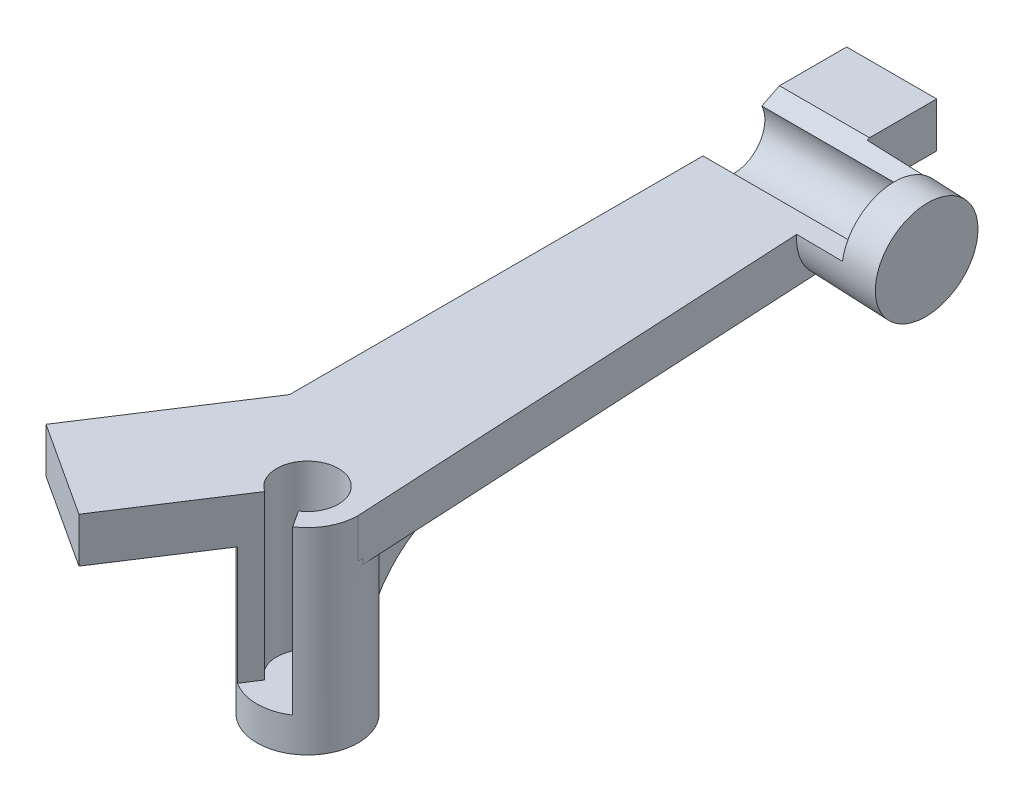
ISO-10303-21;
HEADER;
FILE_DESCRIPTION(('STEP AP214'),'2;1');
FILE_NAME('part.step','',(''),(''),'','','');
FILE_SCHEMA(('AUTOMOTIVE_DESIGN { 1 0 10303 214 1 1 1 1 }'));
ENDSEC;
DATA;
#1=APPLICATION_CONTEXT('core data for automotive mechanical design processes');
#2=APPLICATION_PROTOCOL_DEFINITION('international standard','automotive_design',2000,#1);
#3=PRODUCT_CONTEXT('',#1,'mechanical');
#4=PRODUCT('Part','Part','',(#3));
#5=PRODUCT_RELATED_PRODUCT_CATEGORY('part','',(#4));
#6=PRODUCT_DEFINITION_FORMATION('','',#4);
#7=PRODUCT_DEFINITION_CONTEXT('part definition',#1,'design');
#8=PRODUCT_DEFINITION('design','',#6,#7);
#9=PRODUCT_DEFINITION_SHAPE('','',#8);
#10=(LENGTH_UNIT() NAMED_UNIT(*) SI_UNIT(.MILLI.,.METRE.));
#11=(NAMED_UNIT(*) PLANE_ANGLE_UNIT() SI_UNIT($,.RADIAN.));
#12=(NAMED_UNIT(*) SI_UNIT($,.STERADIAN.) SOLID_ANGLE_UNIT());
#13=UNCERTAINTY_MEASURE_WITH_UNIT(LENGTH_MEASURE(1.E-05),#10,'distance_accuracy_value','');
#14=(GEOMETRIC_REPRESENTATION_CONTEXT(3) GLOBAL_UNCERTAINTY_ASSIGNED_CONTEXT((#13)) GLOBAL_UNIT_ASSIGNED_CONTEXT((#10,
#11,#12)) REPRESENTATION_CONTEXT('',''));
#15=CARTESIAN_POINT('',(0.,0.,0.));
#16=DIRECTION('',(0.,0.,1.));
#17=DIRECTION('',(1.,0.,0.));
#18=AXIS2_PLACEMENT_3D('',#15,#16,#17);
#19=CARTESIAN_POINT('',(0.,13.5,0.));
#20=DIRECTION('',(0.,1.,0.));
#21=DIRECTION('',(0.,0.,1.));
#22=AXIS2_PLACEMENT_3D('',#19,#20,#21);
#23=PLANE('',#22);
#24=CARTESIAN_POINT('',(107.484805674658,13.5,-44.2149505870011));
#25=DIRECTION('',(0.,1.,0.));
#26=DIRECTION('',(0.99991231600444,0.,0.0132423677126259));
#27=AXIS2_PLACEMENT_3D('',#24,#25,#26);
#28=ELLIPSE('',#27,128.941687565297,4.5);
#29=CARTESIAN_POINT('',(2.24609462478623,13.5,-43.0070765456588));
#30=VERTEX_POINT('',#29);
#31=CARTESIAN_POINT('',(-7.8551180309325,13.5,-43.7294317419967));
#32=VERTEX_POINT('',#31);
#33=EDGE_CURVE('E252',#30,#32,#28,.F.);
#34=ORIENTED_EDGE('',*,*,#33,.F.);
#35=DIRECTION('',(-0.0523359562429444,0.,-0.998629534754574));
#36=VECTOR('',#35,1.);
#37=CARTESIAN_POINT('',(4.5,13.5,0.));
#38=LINE('',#37,#36);
#39=CARTESIAN_POINT('',(4.47534852915723,13.5,-0.470378084704455));
#40=VERTEX_POINT('',#39);
#41=EDGE_CURVE('E255',#40,#30,#38,.T.);
#42=ORIENTED_EDGE('',*,*,#41,.F.);
#43=CARTESIAN_POINT('',(0.,13.5,0.));
#44=DIRECTION('',(0.,1.,0.));
#45=DIRECTION('',(0.,0.,1.));
#46=AXIS2_PLACEMENT_3D('',#43,#44,#45);
#47=CIRCLE('',#46,4.5);
#48=CARTESIAN_POINT('',(1.25,13.5,-4.32290411644765));
#49=VERTEX_POINT('',#48);
#50=EDGE_CURVE('E419',#40,#49,#47,.T.);
#51=ORIENTED_EDGE('',*,*,#50,.T.);
#52=DIRECTION('',(0.,0.,-1.));
#53=VECTOR('',#52,1.);
#54=CARTESIAN_POINT('',(1.25,13.5,-13.6448986286721));
#55=LINE('',#54,#53);
#56=CARTESIAN_POINT('',(1.25,13.5,-16.25));
#57=VERTEX_POINT('',#56);
#58=EDGE_CURVE('E298',#49,#57,#55,.T.);
#59=ORIENTED_EDGE('',*,*,#58,.T.);
#60=DIRECTION('',(1.,0.,0.));
#61=VECTOR('',#60,1.);
#62=CARTESIAN_POINT('',(-1.25,13.5,-16.25));
#63=LINE('',#62,#61);
#64=CARTESIAN_POINT('',(-1.25,13.5,-16.25));
#65=VERTEX_POINT('',#64);
#66=EDGE_CURVE('E355',#65,#57,#63,.T.);
#67=ORIENTED_EDGE('',*,*,#66,.F.);
#68=DIRECTION('',(0.,0.,-1.));
#69=VECTOR('',#68,1.);
#70=CARTESIAN_POINT('',(-1.25,13.5,-13.6448986286721));
#71=LINE('',#70,#69);
#72=CARTESIAN_POINT('',(-1.25,13.5,-4.32290411644765));
#73=VERTEX_POINT('',#72);
#74=EDGE_CURVE('E425',#73,#65,#71,.T.);
#75=ORIENTED_EDGE('',*,*,#74,.F.);
#76=CARTESIAN_POINT('',(-2.45454545454546,13.5,3.771631823438));
#77=VERTEX_POINT('',#76);
#78=EDGE_CURVE('E423',#73,#77,#47,.T.);
#79=ORIENTED_EDGE('',*,*,#78,.T.);
#80=DIRECTION('',(0.545454545454545,0.,-0.838140405208444));
#81=VECTOR('',#80,1.);
#82=CARTESIAN_POINT('',(-1.5,13.5,2.30488611432322));
#83=LINE('',#82,#81);
#84=CARTESIAN_POINT('',(-8.00791373455968,13.5,12.3048861143232));
#85=VERTEX_POINT('',#84);
#86=EDGE_CURVE('E266',#85,#77,#83,.T.);
#87=ORIENTED_EDGE('',*,*,#86,.F.);
#88=DIRECTION('',(0.838140405208444,0.,0.545454545454545));
#89=VECTOR('',#88,1.);
#90=CARTESIAN_POINT('',(-8.00791373455968,13.5,12.3048861143232));
#91=LINE('',#90,#89);
#92=CARTESIAN_POINT('',(-16.3893177866441,13.5,6.85034065977777));
#93=VERTEX_POINT('',#92);
#94=EDGE_CURVE('E263',#93,#85,#91,.T.);
#95=ORIENTED_EDGE('',*,*,#94,.F.);
#96=DIRECTION('',(-0.545454545454545,0.,0.838140405208444));
#97=VECTOR('',#96,1.);
#98=CARTESIAN_POINT('',(-16.3893177866441,13.5,6.85034065977777));
#99=LINE('',#98,#97);
#100=CARTESIAN_POINT('',(-7.85511803093249,13.5,-6.26323168275582));
#101=VERTEX_POINT('',#100);
#102=EDGE_CURVE('E260',#101,#93,#99,.T.);
#103=ORIENTED_EDGE('',*,*,#102,.F.);
#104=DIRECTION('',(0.,0.,1.));
#105=VECTOR('',#104,1.);
#106=CARTESIAN_POINT('',(-7.8551180309325,13.5,-44.9383290639558));
#107=LINE('',#106,#105);
#108=EDGE_CURVE('E258',#32,#101,#107,.T.);
#109=ORIENTED_EDGE('',*,*,#108,.F.);
#110=EDGE_LOOP('',(#34,#42,#51,#59,#67,#75,#79,#87,#95,#103,#109));
#111=FACE_BOUND('',#110,.T.);
#112=ADVANCED_FACE('F47',(#111),#23,.F.);
#113=CARTESIAN_POINT('',(0.,17.5,0.));
#114=DIRECTION('',(0.,1.,0.));
#115=DIRECTION('',(0.,0.,1.));
#116=AXIS2_PLACEMENT_3D('',#113,#114,#115);
#117=PLANE('',#116);
#118=DIRECTION('',(-0.0523359562429444,0.,-0.998629534754574));
#119=VECTOR('',#118,1.);
#120=CARTESIAN_POINT('',(4.5,17.5,0.));
#121=LINE('',#120,#119);
#122=CARTESIAN_POINT('',(4.5,17.5,0.));
#123=VERTEX_POINT('',#122);
#124=CARTESIAN_POINT('',(2.34503958605258,17.5,-41.1190942151743));
#125=VERTEX_POINT('',#124);
#126=EDGE_CURVE('E277',#123,#125,#121,.T.);
#127=ORIENTED_EDGE('',*,*,#126,.T.);
#128=CARTESIAN_POINT('',(-7.05016369258182,17.5,-45.7317977705382));
#129=DIRECTION('',(0.,-1.,0.));
#130=DIRECTION('',(0.99991231600444,0.,0.0132423677126259));
#131=AXIS2_PLACEMENT_3D('',#128,#129,#130);
#132=ELLIPSE('',#131,128.941687565297,4.5);
#133=CARTESIAN_POINT('',(6.45918434300709,17.5,-41.0774829767957));
#134=VERTEX_POINT('',#133);
#135=EDGE_CURVE('E12',#134,#125,#132,.T.);
#136=ORIENTED_EDGE('',*,*,#135,.F.);
#137=DIRECTION('',(0.0132423677126259,0.,-0.99991231600444));
#138=VECTOR('',#137,1.);
#139=CARTESIAN_POINT('',(6.48712431997353,17.5,-43.187190823904));
#140=LINE('',#139,#138);
#141=CARTESIAN_POINT('',(6.48454727591692,17.5,-42.9926018994));
#142=VERTEX_POINT('',#141);
#143=EDGE_CURVE('E383',#134,#142,#140,.T.);
#144=ORIENTED_EDGE('',*,*,#143,.T.);
#145=DIRECTION('',(-1.,0.,0.));
#146=VECTOR('',#145,1.);
#147=CARTESIAN_POINT('',(21.1802567259096,17.5,-42.9926018994));
#148=LINE('',#147,#146);
#149=CARTESIAN_POINT('',(-7.8551180309325,17.5,-42.9926018993999));
#150=VERTEX_POINT('',#149);
#151=EDGE_CURVE('E400',#142,#150,#148,.T.);
#152=ORIENTED_EDGE('',*,*,#151,.T.);
#153=DIRECTION('',(0.,0.,1.));
#154=VECTOR('',#153,1.);
#155=CARTESIAN_POINT('',(-7.8551180309325,17.5,-44.9383290639558));
#156=LINE('',#155,#154);
#157=CARTESIAN_POINT('',(-7.85511803093249,17.5,-6.26323168275582));
#158=VERTEX_POINT('',#157);
#159=EDGE_CURVE('E279',#150,#158,#156,.T.);
#160=ORIENTED_EDGE('',*,*,#159,.T.);
#161=DIRECTION('',(-0.545454545454545,0.,0.838140405208444));
#162=VECTOR('',#161,1.);
#163=CARTESIAN_POINT('',(-16.3893177866441,17.5,6.85034065977777));
#164=LINE('',#163,#162);
#165=CARTESIAN_POINT('',(-16.3893177866441,17.5,6.85034065977777));
#166=VERTEX_POINT('',#165);
#167=EDGE_CURVE('E281',#158,#166,#164,.T.);
#168=ORIENTED_EDGE('',*,*,#167,.T.);
#169=DIRECTION('',(0.838140405208444,0.,0.545454545454545));
#170=VECTOR('',#169,1.);
#171=CARTESIAN_POINT('',(-8.00791373455968,17.5,12.3048861143232));
#172=LINE('',#171,#170);
#173=CARTESIAN_POINT('',(-8.00791373455968,17.5,12.3048861143232));
#174=VERTEX_POINT('',#173);
#175=EDGE_CURVE('E283',#166,#174,#172,.T.);
#176=ORIENTED_EDGE('',*,*,#175,.T.);
#177=DIRECTION('',(0.545454545454545,0.,-0.838140405208444));
#178=VECTOR('',#177,1.);
#179=CARTESIAN_POINT('',(-1.5,17.5,2.30488611432322));
#180=LINE('',#179,#178);
#181=CARTESIAN_POINT('',(-1.5,17.5,2.30488611432322));
#182=VERTEX_POINT('',#181);
#183=EDGE_CURVE('E285',#174,#182,#180,.T.);
#184=ORIENTED_EDGE('',*,*,#183,.T.);
#185=CARTESIAN_POINT('',(0.,17.5,0.));
#186=DIRECTION('',(0.,-1.,0.));
#187=DIRECTION('',(0.,0.,1.));
#188=AXIS2_PLACEMENT_3D('',#185,#186,#187);
#189=CIRCLE('',#188,2.75);
#190=CARTESIAN_POINT('',(1.5,17.5,2.30488611432322));
#191=VERTEX_POINT('',#190);
#192=EDGE_CURVE('E269',#182,#191,#189,.T.);
#193=ORIENTED_EDGE('',*,*,#192,.T.);
#194=DIRECTION('',(0.545454545454545,0.,0.838140405208445));
#195=VECTOR('',#194,1.);
#196=CARTESIAN_POINT('',(1.5,17.5,2.30488611432322));
#197=LINE('',#196,#195);
#198=CARTESIAN_POINT('',(2.45454545454545,17.5,3.771631823438));
#199=VERTEX_POINT('',#198);
#200=EDGE_CURVE('E272',#191,#199,#197,.T.);
#201=ORIENTED_EDGE('',*,*,#200,.T.);
#202=CARTESIAN_POINT('',(0.,17.5,0.));
#203=DIRECTION('',(0.,1.,0.));
#204=DIRECTION('',(0.,0.,1.));
#205=AXIS2_PLACEMENT_3D('',#202,#203,#204);
#206=CIRCLE('',#205,4.5);
#207=EDGE_CURVE('E275',#199,#123,#206,.T.);
#208=ORIENTED_EDGE('',*,*,#207,.T.);
#209=EDGE_LOOP('',(#127,#136,#144,#152,#160,#168,#176,#184,#193,#201,#208));
#210=FACE_BOUND('',#209,.T.);
#211=ADVANCED_FACE('F410',(#210),#117,.T.);
#212=CARTESIAN_POINT('',(0.,3.,0.));
#213=DIRECTION('',(0.,-1.,0.));
#214=DIRECTION('',(0.,0.,-1.));
#215=AXIS2_PLACEMENT_3D('',#212,#213,#214);
#216=CYLINDRICAL_SURFACE('',#215,4.5);
#217=CARTESIAN_POINT('',(4.5,14.,0.));
#218=DIRECTION('',(-0.0523359562429439,0.,-0.998629534754574));
#219=VECTOR('',#218,1.);
#220=LINE('',#217,#219);
#221=CARTESIAN_POINT('',(4.5,14.,0.));
#222=VERTEX_POINT('',#221);
#223=CARTESIAN_POINT('',(4.47534852915723,14.,-0.47037808470442));
#224=VERTEX_POINT('',#223);
#225=EDGE_CURVE('E360',#222,#224,#220,.T.);
#226=ORIENTED_EDGE('',*,*,#225,.F.);
#227=DIRECTION('',(0.,-1.,0.));
#228=VECTOR('',#227,1.);
#229=CARTESIAN_POINT('',(4.5,17.5,0.));
#230=LINE('',#229,#228);
#231=EDGE_CURVE('E295',#123,#222,#230,.T.);
#232=ORIENTED_EDGE('',*,*,#231,.F.);
#233=ORIENTED_EDGE('',*,*,#207,.F.);
#234=DIRECTION('',(0.,-1.,0.));
#235=VECTOR('',#234,1.);
#236=CARTESIAN_POINT('',(2.45454545454545,14.,3.771631823438));
#237=LINE('',#236,#235);
#238=CARTESIAN_POINT('',(2.45454545454545,3.,3.771631823438));
#239=VERTEX_POINT('',#238);
#240=EDGE_CURVE('E343',#199,#239,#237,.T.);
#241=ORIENTED_EDGE('',*,*,#240,.T.);
#242=CARTESIAN_POINT('',(0.,3.,0.));
#243=DIRECTION('',(0.,1.,0.));
#244=DIRECTION('',(0.,0.,1.));
#245=AXIS2_PLACEMENT_3D('',#242,#243,#244);
#246=CIRCLE('',#245,4.5);
#247=CARTESIAN_POINT('',(-2.45454545454545,3.,3.771631823438));
#248=VERTEX_POINT('',#247);
#249=EDGE_CURVE('E352',#248,#239,#246,.T.);
#250=ORIENTED_EDGE('',*,*,#249,.F.);
#251=DIRECTION('',(0.,-1.,0.));
#252=VECTOR('',#251,1.);
#253=CARTESIAN_POINT('',(-2.45454545454545,14.,3.771631823438));
#254=LINE('',#253,#252);
#255=EDGE_CURVE('E349',#77,#248,#254,.T.);
#256=ORIENTED_EDGE('',*,*,#255,.F.);
#257=ORIENTED_EDGE('',*,*,#78,.F.);
#258=DIRECTION('',(0.,-1.,0.));
#259=VECTOR('',#258,1.);
#260=CARTESIAN_POINT('',(-1.25,3.,-4.32290411644765));
#261=LINE('',#260,#259);
#262=CARTESIAN_POINT('',(-1.25,5.88365754682068,-4.32290411644764));
#263=VERTEX_POINT('',#262);
#264=EDGE_CURVE('E329',#73,#263,#261,.T.);
#265=ORIENTED_EDGE('',*,*,#264,.T.);
#266=CARTESIAN_POINT('',(0.,-2.04166666666667,0.));
#267=DIRECTION('',(0.,-0.478852130680573,-0.877895572914384));
#268=DIRECTION('',(0.,-0.877895572914384,0.478852130680573));
#269=AXIS2_PLACEMENT_3D('',#266,#267,#268);
#270=ELLIPSE('',#269,9.39747306460625,4.5);
#271=CARTESIAN_POINT('',(1.25,5.88365754682069,-4.32290411644765));
#272=VERTEX_POINT('',#271);
#273=EDGE_CURVE('E331',#263,#272,#270,.T.);
#274=ORIENTED_EDGE('',*,*,#273,.T.);
#275=DIRECTION('',(0.,-1.,0.));
#276=VECTOR('',#275,1.);
#277=CARTESIAN_POINT('',(1.25,3.,-4.32290411644765));
#278=LINE('',#277,#276);
#279=EDGE_CURVE('E325',#49,#272,#278,.T.);
#280=ORIENTED_EDGE('',*,*,#279,.F.);
#281=ORIENTED_EDGE('',*,*,#50,.F.);
#282=DIRECTION('',(0.,-1.,0.));
#283=VECTOR('',#282,1.);
#284=CARTESIAN_POINT('',(4.47534852915723,3.,-0.47037808470447));
#285=LINE('',#284,#283);
#286=EDGE_CURVE('E303',#224,#40,#285,.T.);
#287=ORIENTED_EDGE('',*,*,#286,.F.);
#288=EDGE_LOOP('',(#226,#232,#233,#241,#250,#256,#257,#265,#274,#280,#281,#287));
#289=FACE_BOUND('',#288,.T.);
#290=CARTESIAN_POINT('',(0.,0.,0.));
#291=DIRECTION('',(0.,1.,0.));
#292=DIRECTION('',(0.,0.,1.));
#293=AXIS2_PLACEMENT_3D('',#290,#291,#292);
#294=CIRCLE('',#293,4.5);
#295=CARTESIAN_POINT('',(0.,0.,4.5));
#296=VERTEX_POINT('',#295);
#297=EDGE_CURVE('E351',#296,#296,#294,.T.);
#298=ORIENTED_EDGE('',*,*,#297,.T.);
#299=EDGE_LOOP('',(#298));
#300=FACE_BOUND('',#299,.T.);
#301=ADVANCED_FACE('F49',(#289,#300),#216,.T.);
#302=CARTESIAN_POINT('',(-1.25,2.09070734232945,-13.6448986286721));
#303=DIRECTION('',(-1.,0.,0.));
#304=DIRECTION('',(0.,0.,1.));
#305=AXIS2_PLACEMENT_3D('',#302,#303,#304);
#306=PLANE('',#305);
#307=ORIENTED_EDGE('',*,*,#264,.F.);
#308=ORIENTED_EDGE('',*,*,#74,.T.);
#309=DIRECTION('',(0.,0.316227766016838,-0.948683298050514));
#310=VECTOR('',#309,1.);
#311=CARTESIAN_POINT('',(-1.25,11.5775403228346,-10.4826209685038));
#312=LINE('',#311,#310);
#313=CARTESIAN_POINT('',(-1.25,11.5775403228346,-10.4826209685038));
#314=VERTEX_POINT('',#313);
#315=EDGE_CURVE('E319',#314,#65,#312,.T.);
#316=ORIENTED_EDGE('',*,*,#315,.F.);
#317=CARTESIAN_POINT('',(-1.25,2.09070734232945,-13.6448986286721));
#318=DIRECTION('',(-1.,0.,0.));
#319=DIRECTION('',(0.,0.,1.));
#320=AXIS2_PLACEMENT_3D('',#317,#318,#319);
#321=CIRCLE('',#320,10.);
#322=CARTESIAN_POINT('',(-1.25,6.87922864913514,-4.86594289952826));
#323=VERTEX_POINT('',#322);
#324=EDGE_CURVE('E316',#323,#314,#321,.T.);
#325=ORIENTED_EDGE('',*,*,#324,.F.);
#326=DIRECTION('',(0.,0.877895572914384,-0.478852130680573));
#327=VECTOR('',#326,1.);
#328=CARTESIAN_POINT('',(-1.25,3.,-2.75));
#329=LINE('',#328,#327);
#330=EDGE_CURVE('E314',#263,#323,#329,.T.);
#331=ORIENTED_EDGE('',*,*,#330,.F.);
#332=EDGE_LOOP('',(#307,#308,#316,#325,#331));
#333=FACE_BOUND('',#332,.T.);
#334=ADVANCED_FACE('F446',(#333),#306,.T.);
#335=CARTESIAN_POINT('',(1.25,2.09070734232945,-13.6448986286721));
#336=DIRECTION('',(-1.,0.,0.));
#337=DIRECTION('',(0.,0.,1.));
#338=AXIS2_PLACEMENT_3D('',#335,#336,#337);
#339=PLANE('',#338);
#340=ORIENTED_EDGE('',*,*,#58,.F.);
#341=ORIENTED_EDGE('',*,*,#279,.T.);
#342=DIRECTION('',(0.,0.877895572914384,-0.478852130680573));
#343=VECTOR('',#342,1.);
#344=CARTESIAN_POINT('',(1.25,3.,-2.75));
#345=LINE('',#344,#343);
#346=CARTESIAN_POINT('',(1.25,6.87922864913514,-4.86594289952826));
#347=VERTEX_POINT('',#346);
#348=EDGE_CURVE('E306',#272,#347,#345,.T.);
#349=ORIENTED_EDGE('',*,*,#348,.T.);
#350=CARTESIAN_POINT('',(1.25,2.09070734232945,-13.6448986286721));
#351=DIRECTION('',(-1.,0.,0.));
#352=DIRECTION('',(0.,0.,1.));
#353=AXIS2_PLACEMENT_3D('',#350,#351,#352);
#354=CIRCLE('',#353,10.);
#355=CARTESIAN_POINT('',(1.25,11.5775403228346,-10.4826209685038));
#356=VERTEX_POINT('',#355);
#357=EDGE_CURVE('E308',#347,#356,#354,.T.);
#358=ORIENTED_EDGE('',*,*,#357,.T.);
#359=DIRECTION('',(0.,0.316227766016838,-0.948683298050514));
#360=VECTOR('',#359,1.);
#361=CARTESIAN_POINT('',(1.25,11.5775403228346,-10.4826209685038));
#362=LINE('',#361,#360);
#363=EDGE_CURVE('E311',#356,#57,#362,.T.);
#364=ORIENTED_EDGE('',*,*,#363,.T.);
#365=EDGE_LOOP('',(#340,#341,#349,#358,#364));
#366=FACE_BOUND('',#365,.T.);
#367=ADVANCED_FACE('F442',(#366),#339,.F.);
#368=CARTESIAN_POINT('',(-1.25,11.5775403228346,-10.4826209685038));
#369=DIRECTION('',(0.,-0.948683298050514,-0.316227766016838));
#370=DIRECTION('',(0.,0.316227766016838,-0.948683298050514));
#371=AXIS2_PLACEMENT_3D('',#368,#369,#370);
#372=PLANE('',#371);
#373=ORIENTED_EDGE('',*,*,#315,.T.);
#374=ORIENTED_EDGE('',*,*,#66,.T.);
#375=ORIENTED_EDGE('',*,*,#363,.F.);
#376=DIRECTION('',(1.,0.,0.));
#377=VECTOR('',#376,1.);
#378=CARTESIAN_POINT('',(-1.25,11.5775403228346,-10.4826209685038));
#379=LINE('',#378,#377);
#380=EDGE_CURVE('E323',#314,#356,#379,.T.);
#381=ORIENTED_EDGE('',*,*,#380,.F.);
#382=EDGE_LOOP('',(#373,#374,#375,#381));
#383=FACE_BOUND('',#382,.T.);
#384=ADVANCED_FACE('F445',(#383),#372,.T.);
#385=CARTESIAN_POINT('',(0.,3.,0.));
#386=DIRECTION('',(0.,1.,0.));
#387=DIRECTION('',(0.,0.,1.));
#388=AXIS2_PLACEMENT_3D('',#385,#386,#387);
#389=PLANE('',#388);
#390=DIRECTION('',(0.545454545454545,0.,0.838140405208445));
#391=VECTOR('',#390,1.);
#392=CARTESIAN_POINT('',(1.5,3.,2.30488611432322));
#393=LINE('',#392,#391);
#394=CARTESIAN_POINT('',(1.5,3.,2.30488611432322));
#395=VERTEX_POINT('',#394);
#396=EDGE_CURVE('E340',#395,#239,#393,.T.);
#397=ORIENTED_EDGE('',*,*,#396,.F.);
#398=CARTESIAN_POINT('',(0.,3.,0.));
#399=DIRECTION('',(0.,-1.,0.));
#400=DIRECTION('',(0.,0.,1.));
#401=AXIS2_PLACEMENT_3D('',#398,#399,#400);
#402=CIRCLE('',#401,2.75);
#403=CARTESIAN_POINT('',(-1.5,3.,2.30488611432322));
#404=VERTEX_POINT('',#403);
#405=EDGE_CURVE('E337',#404,#395,#402,.T.);
#406=ORIENTED_EDGE('',*,*,#405,.F.);
#407=DIRECTION('',(0.545454545454545,0.,-0.838140405208445));
#408=VECTOR('',#407,1.);
#409=CARTESIAN_POINT('',(-2.45454545454545,3.,3.771631823438));
#410=LINE('',#409,#408);
#411=EDGE_CURVE('E334',#248,#404,#410,.T.);
#412=ORIENTED_EDGE('',*,*,#411,.F.);
#413=ORIENTED_EDGE('',*,*,#249,.T.);
#414=EDGE_LOOP('',(#397,#406,#412,#413));
#415=FACE_BOUND('',#414,.T.);
#416=ADVANCED_FACE('F453',(#415),#389,.T.);
#417=CARTESIAN_POINT('',(0.,0.,0.));
#418=DIRECTION('',(0.,1.,0.));
#419=DIRECTION('',(0.,0.,1.));
#420=AXIS2_PLACEMENT_3D('',#417,#418,#419);
#421=PLANE('',#420);
#422=ORIENTED_EDGE('',*,*,#297,.F.);
#423=EDGE_LOOP('',(#422));
#424=FACE_BOUND('',#423,.T.);
#425=ADVANCED_FACE('F473',(#424),#421,.F.);
#426=CARTESIAN_POINT('',(-2.45454545454545,14.,3.771631823438));
#427=DIRECTION('',(-0.838140405208445,0.,-0.545454545454545));
#428=DIRECTION('',(-0.545454545454545,0.,0.838140405208445));
#429=AXIS2_PLACEMENT_3D('',#426,#427,#428);
#430=PLANE('',#429);
#431=ORIENTED_EDGE('',*,*,#86,.T.);
#432=ORIENTED_EDGE('',*,*,#255,.T.);
#433=ORIENTED_EDGE('',*,*,#411,.T.);
#434=DIRECTION('',(0.,-1.,0.));
#435=VECTOR('',#434,1.);
#436=CARTESIAN_POINT('',(-1.5,14.,2.30488611432322));
#437=LINE('',#436,#435);
#438=EDGE_CURVE('E347',#182,#404,#437,.T.);
#439=ORIENTED_EDGE('',*,*,#438,.F.);
#440=ORIENTED_EDGE('',*,*,#183,.F.);
#441=DIRECTION('',(0.,-1.,0.));
#442=VECTOR('',#441,1.);
#443=CARTESIAN_POINT('',(-8.00791373455968,17.5,12.3048861143232));
#444=LINE('',#443,#442);
#445=EDGE_CURVE('E288',#174,#85,#444,.T.);
#446=ORIENTED_EDGE('',*,*,#445,.T.);
#447=EDGE_LOOP('',(#431,#432,#433,#439,#440,#446));
#448=FACE_BOUND('',#447,.T.);
#449=ADVANCED_FACE('F469',(#448),#430,.F.);
#450=CARTESIAN_POINT('',(0.,14.,0.));
#451=DIRECTION('',(0.,-1.,0.));
#452=DIRECTION('',(0.,0.,-1.));
#453=AXIS2_PLACEMENT_3D('',#450,#451,#452);
#454=CYLINDRICAL_SURFACE('',#453,2.75);
#455=ORIENTED_EDGE('',*,*,#438,.T.);
#456=ORIENTED_EDGE('',*,*,#405,.T.);
#457=DIRECTION('',(0.,-1.,0.));
#458=VECTOR('',#457,1.);
#459=CARTESIAN_POINT('',(1.5,14.,2.30488611432322));
#460=LINE('',#459,#458);
#461=EDGE_CURVE('E345',#191,#395,#460,.T.);
#462=ORIENTED_EDGE('',*,*,#461,.F.);
#463=ORIENTED_EDGE('',*,*,#192,.F.);
#464=EDGE_LOOP('',(#455,#456,#462,#463));
#465=FACE_BOUND('',#464,.T.);
#466=ADVANCED_FACE('F465',(#465),#454,.F.);
#467=CARTESIAN_POINT('',(1.5,14.,2.30488611432322));
#468=DIRECTION('',(0.838140405208445,0.,-0.545454545454545));
#469=DIRECTION('',(-0.545454545454545,0.,-0.838140405208445));
#470=AXIS2_PLACEMENT_3D('',#467,#468,#469);
#471=PLANE('',#470);
#472=ORIENTED_EDGE('',*,*,#461,.T.);
#473=ORIENTED_EDGE('',*,*,#396,.T.);
#474=ORIENTED_EDGE('',*,*,#240,.F.);
#475=ORIENTED_EDGE('',*,*,#200,.F.);
#476=EDGE_LOOP('',(#472,#473,#474,#475));
#477=FACE_BOUND('',#476,.T.);
#478=ADVANCED_FACE('F461',(#477),#471,.F.);
#479=CARTESIAN_POINT('',(-1.25,3.,-2.75));
#480=DIRECTION('',(0.,-0.478852130680573,-0.877895572914384));
#481=DIRECTION('',(0.,0.877895572914384,-0.478852130680573));
#482=AXIS2_PLACEMENT_3D('',#479,#480,#481);
#483=PLANE('',#482);
#484=ORIENTED_EDGE('',*,*,#273,.F.);
#485=ORIENTED_EDGE('',*,*,#330,.T.);
#486=DIRECTION('',(1.,0.,0.));
#487=VECTOR('',#486,1.);
#488=CARTESIAN_POINT('',(-1.25,6.87922864913514,-4.86594289952826));
#489=LINE('',#488,#487);
#490=EDGE_CURVE('E322',#323,#347,#489,.T.);
#491=ORIENTED_EDGE('',*,*,#490,.T.);
#492=ORIENTED_EDGE('',*,*,#348,.F.);
#493=EDGE_LOOP('',(#484,#485,#491,#492));
#494=FACE_BOUND('',#493,.T.);
#495=ADVANCED_FACE('F457',(#494),#483,.T.);
#496=CARTESIAN_POINT('',(-1.25,2.09070734232945,-13.6448986286721));
#497=DIRECTION('',(1.,0.,0.));
#498=DIRECTION('',(0.,0.,-1.));
#499=AXIS2_PLACEMENT_3D('',#496,#497,#498);
#500=CYLINDRICAL_SURFACE('',#499,10.);
#501=ORIENTED_EDGE('',*,*,#380,.T.);
#502=ORIENTED_EDGE('',*,*,#357,.F.);
#503=ORIENTED_EDGE('',*,*,#490,.F.);
#504=ORIENTED_EDGE('',*,*,#324,.T.);
#505=EDGE_LOOP('',(#501,#502,#503,#504));
#506=FACE_BOUND('',#505,.T.);
#507=ADVANCED_FACE('F440',(#506),#500,.F.);
#508=CARTESIAN_POINT('',(4.5,17.5,0.));
#509=DIRECTION('',(-0.998629534754574,0.,0.0523359562429444));
#510=DIRECTION('',(0.0523359562429444,0.,0.998629534754574));
#511=AXIS2_PLACEMENT_3D('',#508,#509,#510);
#512=PLANE('',#511);
#513=CARTESIAN_POINT('',(2.10965553647226,17.1801040143579,-45.6104894393267));
#514=DIRECTION('',(-0.998629534754574,0.,0.0523359562429444));
#515=DIRECTION('',(0.0461911285928148,-0.470145740899974,0.881379238439922));
#516=AXIS2_PLACEMENT_3D('',#513,#514,#515);
#517=ELLIPSE('',#516,4.51244959415703,4.5);
#518=EDGE_CURVE('E249',#125,#30,#517,.F.);
#519=ORIENTED_EDGE('',*,*,#518,.F.);
#520=ORIENTED_EDGE('',*,*,#126,.F.);
#521=ORIENTED_EDGE('',*,*,#231,.T.);
#522=ORIENTED_EDGE('',*,*,#225,.T.);
#523=ORIENTED_EDGE('',*,*,#286,.T.);
#524=ORIENTED_EDGE('',*,*,#41,.T.);
#525=EDGE_LOOP('',(#519,#520,#521,#522,#523,#524));
#526=FACE_BOUND('',#525,.T.);
#527=ADVANCED_FACE('F415',(#526),#512,.F.);
#528=CARTESIAN_POINT('',(-7.8551180309325,17.5,-44.9383290639558));
#529=DIRECTION('',(1.,0.,0.));
#530=DIRECTION('',(0.,0.,-1.));
#531=AXIS2_PLACEMENT_3D('',#528,#529,#530);
#532=PLANE('',#531);
#533=ORIENTED_EDGE('',*,*,#159,.F.);
#534=CARTESIAN_POINT('',(-7.8551180309325,17.5281120898813,-45.7424582066281));
#535=DIRECTION('',(-1.,0.,0.));
#536=DIRECTION('',(0.,0.,1.));
#537=AXIS2_PLACEMENT_3D('',#534,#535,#536);
#538=CIRCLE('',#537,2.75);
#539=CARTESIAN_POINT('',(-7.8551180309325,18.7327093647106,-48.2145919824327));
#540=VERTEX_POINT('',#539);
#541=EDGE_CURVE('E215',#540,#150,#538,.T.);
#542=ORIENTED_EDGE('',*,*,#541,.F.);
#543=DIRECTION('',(0.,-0.438035372665193,0.898957736656215));
#544=VECTOR('',#543,1.);
#545=CARTESIAN_POINT('',(-7.8551180309325,19.5,-49.7892635635438));
#546=LINE('',#545,#544);
#547=CARTESIAN_POINT('',(-7.8551180309325,19.5,-49.7892635635438));
#548=VERTEX_POINT('',#547);
#549=EDGE_CURVE('E208',#548,#540,#546,.T.);
#550=ORIENTED_EDGE('',*,*,#549,.F.);
#551=DIRECTION('',(0.,0.,-1.));
#552=VECTOR('',#551,1.);
#553=CARTESIAN_POINT('',(-7.8551180309325,19.5,-55.7595556284015));
#554=LINE('',#553,#552);
#555=CARTESIAN_POINT('',(-7.8551180309325,19.5,-55.7595556284015));
#556=VERTEX_POINT('',#555);
#557=EDGE_CURVE('E220',#548,#556,#554,.T.);
#558=ORIENTED_EDGE('',*,*,#557,.T.);
#559=DIRECTION('',(0.,-1.,0.));
#560=VECTOR('',#559,1.);
#561=CARTESIAN_POINT('',(-7.8551180309325,15.5,-55.7595556284015));
#562=LINE('',#561,#560);
#563=CARTESIAN_POINT('',(-7.8551180309325,15.5,-55.7595556284015));
#564=VERTEX_POINT('',#563);
#565=EDGE_CURVE('E228',#556,#564,#562,.T.);
#566=ORIENTED_EDGE('',*,*,#565,.T.);
#567=DIRECTION('',(0.,0.,1.));
#568=VECTOR('',#567,1.);
#569=CARTESIAN_POINT('',(-7.8551180309325,15.5,-49.7595556284015));
#570=LINE('',#569,#568);
#571=CARTESIAN_POINT('',(-7.8551180309325,15.5,-49.7595556284015));
#572=VERTEX_POINT('',#571);
#573=EDGE_CURVE('E230',#564,#572,#570,.T.);
#574=ORIENTED_EDGE('',*,*,#573,.T.);
#575=CARTESIAN_POINT('',(-7.8551180309325,17.5281120898813,-45.7424582066281));
#576=DIRECTION('',(1.,0.,0.));
#577=DIRECTION('',(0.,-0.935028078547467,0.354573676868195));
#578=AXIS2_PLACEMENT_3D('',#575,#576,#577);
#579=ELLIPSE('',#578,4.50313780245977,4.5);
#580=EDGE_CURVE('E247',#32,#572,#579,.T.);
#581=ORIENTED_EDGE('',*,*,#580,.F.);
#582=ORIENTED_EDGE('',*,*,#108,.T.);
#583=DIRECTION('',(0.,-1.,0.));
#584=VECTOR('',#583,1.);
#585=CARTESIAN_POINT('',(-7.85511803093249,17.5,-6.26323168275582));
#586=LINE('',#585,#584);
#587=EDGE_CURVE('E292',#158,#101,#586,.T.);
#588=ORIENTED_EDGE('',*,*,#587,.F.);
#589=EDGE_LOOP('',(#533,#542,#550,#558,#566,#574,#581,#582,#588));
#590=FACE_BOUND('',#589,.T.);
#591=ADVANCED_FACE('F218',(#590),#532,.F.);
#592=CARTESIAN_POINT('',(-16.3893177866441,17.5,6.85034065977777));
#593=DIRECTION('',(0.838140405208444,0.,0.545454545454545));
#594=DIRECTION('',(0.545454545454545,0.,-0.838140405208444));
#595=AXIS2_PLACEMENT_3D('',#592,#593,#594);
#596=PLANE('',#595);
#597=ORIENTED_EDGE('',*,*,#587,.T.);
#598=ORIENTED_EDGE('',*,*,#102,.T.);
#599=DIRECTION('',(0.,-1.,0.));
#600=VECTOR('',#599,1.);
#601=CARTESIAN_POINT('',(-16.3893177866441,17.5,6.85034065977777));
#602=LINE('',#601,#600);
#603=EDGE_CURVE('E290',#166,#93,#602,.T.);
#604=ORIENTED_EDGE('',*,*,#603,.F.);
#605=ORIENTED_EDGE('',*,*,#167,.F.);
#606=EDGE_LOOP('',(#597,#598,#604,#605));
#607=FACE_BOUND('',#606,.T.);
#608=ADVANCED_FACE('F497',(#607),#596,.F.);
#609=CARTESIAN_POINT('',(-8.00791373455968,17.5,12.3048861143232));
#610=DIRECTION('',(0.545454545454545,0.,-0.838140405208444));
#611=DIRECTION('',(-0.838140405208444,0.,-0.545454545454545));
#612=AXIS2_PLACEMENT_3D('',#609,#610,#611);
#613=PLANE('',#612);
#614=ORIENTED_EDGE('',*,*,#603,.T.);
#615=ORIENTED_EDGE('',*,*,#94,.T.);
#616=ORIENTED_EDGE('',*,*,#445,.F.);
#617=ORIENTED_EDGE('',*,*,#175,.F.);
#618=EDGE_LOOP('',(#614,#615,#616,#617));
#619=FACE_BOUND('',#618,.T.);
#620=ADVANCED_FACE('F495',(#619),#613,.F.);
#621=CARTESIAN_POINT('',(-20.5786056615774,17.9724650312035,-45.9109620835133));
#622=DIRECTION('',(0.999303196438257,-0.034899496702501,0.0132343008200121));
#623=DIRECTION('',(0.0349025533701879,0.999390720273228,0.));
#624=AXIS2_PLACEMENT_3D('',#621,#622,#623);
#625=CYLINDRICAL_SURFACE('',#624,4.5);
#626=CARTESIAN_POINT('',(6.50191785997479,17.0267093839575,-45.5523203860535));
#627=DIRECTION('',(-0.999303196438257,0.034899496702501,-0.0132343008200121));
#628=DIRECTION('',(-0.0349025533701879,-0.999390720273228,0.));
#629=AXIS2_PLACEMENT_3D('',#626,#627,#628);
#630=CIRCLE('',#629,4.5);
#631=CARTESIAN_POINT('',(6.63327588666063,19.3207676822499,-49.4214341854734));
#632=VERTEX_POINT('',#631);
#633=EDGE_CURVE('E56',#134,#632,#630,.T.);
#634=ORIENTED_EDGE('',*,*,#633,.F.);
#635=ORIENTED_EDGE('',*,*,#135,.T.);
#636=ORIENTED_EDGE('',*,*,#518,.T.);
#637=ORIENTED_EDGE('',*,*,#33,.T.);
#638=ORIENTED_EDGE('',*,*,#580,.T.);
#639=CARTESIAN_POINT('',(50.217320991038,15.5,-44.9733741787696));
#640=DIRECTION('',(0.,-1.,0.));
#641=DIRECTION('',(0.99991231600444,0.,0.0132423677126259));
#642=AXIS2_PLACEMENT_3D('',#639,#640,#641);
#643=ELLIPSE('',#642,128.941687565297,4.5);
#644=CARTESIAN_POINT('',(0.144881969067505,15.5,-49.7828350024373));
#645=VERTEX_POINT('',#644);
#646=EDGE_CURVE('E71',#572,#645,#643,.T.);
#647=ORIENTED_EDGE('',*,*,#646,.T.);
#648=CARTESIAN_POINT('',(0.144881969067503,17.2487214358585,-45.6365099749628));
#649=DIRECTION('',(1.,0.,0.));
#650=DIRECTION('',(0.,-0.935028078547469,0.354573676868192));
#651=AXIS2_PLACEMENT_3D('',#648,#649,#650);
#652=ELLIPSE('',#651,4.50313780245977,4.5);
#653=CARTESIAN_POINT('',(0.144881969067503,19.4026936331492,-49.5895666514561));
#654=VERTEX_POINT('',#653);
#655=EDGE_CURVE('E369',#645,#654,#652,.T.);
#656=ORIENTED_EDGE('',*,*,#655,.T.);
#657=CARTESIAN_POINT('',(-7.85511803093247,17.5281120898813,-45.7424582066281));
#658=DIRECTION('',(0.,-0.898957736656215,-0.438035372665193));
#659=DIRECTION('',(0.999630196923293,-0.0119115776394635,0.0244455255054512));
#660=AXIS2_PLACEMENT_3D('',#657,#658,#659);
#661=ELLIPSE('',#660,175.945644576143,4.5);
#662=EDGE_CURVE('E63',#654,#632,#661,.T.);
#663=ORIENTED_EDGE('',*,*,#662,.T.);
#664=EDGE_LOOP('',(#634,#635,#636,#637,#638,#647,#656,#663));
#665=FACE_BOUND('',#664,.T.);
#666=CARTESIAN_POINT('',(9.49982744928956,16.92201089385,-45.5126174835935));
#667=DIRECTION('',(-0.999303196438257,0.034899496702501,-0.0132343008200121));
#668=DIRECTION('',(-0.0349025533701879,-0.999390720273228,0.));
#669=AXIS2_PLACEMENT_3D('',#666,#667,#668);
#670=CIRCLE('',#669,4.5);
#671=CARTESIAN_POINT('',(9.34276595912371,12.4247526526205,-45.5126174835935));
#672=VERTEX_POINT('',#671);
#673=EDGE_CURVE('E243',#672,#672,#670,.T.);
#674=ORIENTED_EDGE('',*,*,#673,.T.);
#675=EDGE_LOOP('',(#674));
#676=FACE_BOUND('',#675,.T.);
#677=ADVANCED_FACE('F385',(#665,#676),#625,.T.);
#678=CARTESIAN_POINT('',(9.49982744928956,16.92201089385,-45.5126174835935));
#679=DIRECTION('',(-0.999303196438257,0.034899496702501,-0.0132343008200121));
#680=DIRECTION('',(-0.0349025533701879,-0.999390720273228,0.));
#681=AXIS2_PLACEMENT_3D('',#678,#679,#680);
#682=PLANE('',#681);
#683=ORIENTED_EDGE('',*,*,#673,.F.);
#684=EDGE_LOOP('',(#683));
#685=FACE_BOUND('',#684,.T.);
#686=ADVANCED_FACE('F544',(#685),#682,.F.);
#687=CARTESIAN_POINT('',(0.144881969067505,15.5,-49.7595556284015));
#688=DIRECTION('',(0.,-1.,0.));
#689=DIRECTION('',(0.,0.,-1.));
#690=AXIS2_PLACEMENT_3D('',#687,#688,#689);
#691=PLANE('',#690);
#692=ORIENTED_EDGE('',*,*,#646,.F.);
#693=ORIENTED_EDGE('',*,*,#573,.F.);
#694=DIRECTION('',(-1.,0.,0.));
#695=VECTOR('',#694,1.);
#696=CARTESIAN_POINT('',(0.144881969067503,15.5,-55.7595556284015));
#697=LINE('',#696,#695);
#698=CARTESIAN_POINT('',(0.144881969067503,15.5,-55.7595556284015));
#699=VERTEX_POINT('',#698);
#700=EDGE_CURVE('E241',#699,#564,#697,.T.);
#701=ORIENTED_EDGE('',*,*,#700,.F.);
#702=DIRECTION('',(0.,0.,1.));
#703=VECTOR('',#702,1.);
#704=CARTESIAN_POINT('',(0.144881969067505,15.5,-49.190279670793));
#705=LINE('',#704,#703);
#706=EDGE_CURVE('E240',#699,#645,#705,.T.);
#707=ORIENTED_EDGE('',*,*,#706,.T.);
#708=EDGE_LOOP('',(#692,#693,#701,#707));
#709=FACE_BOUND('',#708,.T.);
#710=ADVANCED_FACE('F393',(#709),#691,.T.);
#711=CARTESIAN_POINT('',(0.144881969067503,15.5,-55.7595556284015));
#712=DIRECTION('',(0.,0.,-1.));
#713=DIRECTION('',(-1.,0.,0.));
#714=AXIS2_PLACEMENT_3D('',#711,#712,#713);
#715=PLANE('',#714);
#716=ORIENTED_EDGE('',*,*,#565,.F.);
#717=DIRECTION('',(-1.,0.,0.));
#718=VECTOR('',#717,1.);
#719=CARTESIAN_POINT('',(0.144881969067503,19.5,-55.7595556284015));
#720=LINE('',#719,#718);
#721=CARTESIAN_POINT('',(0.144881969067503,19.5,-55.7595556284015));
#722=VERTEX_POINT('',#721);
#723=EDGE_CURVE('E226',#722,#556,#720,.T.);
#724=ORIENTED_EDGE('',*,*,#723,.F.);
#725=DIRECTION('',(0.,-1.,0.));
#726=VECTOR('',#725,1.);
#727=CARTESIAN_POINT('',(0.144881969067503,15.5,-55.7595556284015));
#728=LINE('',#727,#726);
#729=EDGE_CURVE('E235',#722,#699,#728,.T.);
#730=ORIENTED_EDGE('',*,*,#729,.T.);
#731=ORIENTED_EDGE('',*,*,#700,.T.);
#732=EDGE_LOOP('',(#716,#724,#730,#731));
#733=FACE_BOUND('',#732,.T.);
#734=ADVANCED_FACE('F534',(#733),#715,.T.);
#735=CARTESIAN_POINT('',(0.144881969067503,19.5,-55.7595556284015));
#736=DIRECTION('',(0.,1.,0.));
#737=DIRECTION('',(0.,0.,1.));
#738=AXIS2_PLACEMENT_3D('',#735,#736,#737);
#739=PLANE('',#738);
#740=DIRECTION('',(-1.,0.,0.));
#741=VECTOR('',#740,1.);
#742=CARTESIAN_POINT('',(21.1802567259096,19.5,-49.7892635635438));
#743=LINE('',#742,#741);
#744=CARTESIAN_POINT('',(0.14488196906751,19.5,-49.7892635635438));
#745=VERTEX_POINT('',#744);
#746=EDGE_CURVE('E204',#745,#548,#743,.T.);
#747=ORIENTED_EDGE('',*,*,#746,.F.);
#748=DIRECTION('',(0.,0.,-1.));
#749=VECTOR('',#748,1.);
#750=CARTESIAN_POINT('',(0.144881969067505,19.5,-49.7892635635438));
#751=LINE('',#750,#749);
#752=EDGE_CURVE('E396',#745,#722,#751,.T.);
#753=ORIENTED_EDGE('',*,*,#752,.T.);
#754=ORIENTED_EDGE('',*,*,#723,.T.);
#755=ORIENTED_EDGE('',*,*,#557,.F.);
#756=EDGE_LOOP('',(#747,#753,#754,#755));
#757=FACE_BOUND('',#756,.T.);
#758=ADVANCED_FACE('F224',(#757),#739,.T.);
#759=CARTESIAN_POINT('',(0.144881969067503,17.4922027656902,-49.7426726360685));
#760=DIRECTION('',(1.,0.,0.));
#761=DIRECTION('',(0.,0.,-1.));
#762=AXIS2_PLACEMENT_3D('',#759,#760,#761);
#763=PLANE('',#762);
#764=DIRECTION('',(0.,0.438035372665193,-0.898957736656215));
#765=VECTOR('',#764,1.);
#766=CARTESIAN_POINT('',(0.144881969067503,19.0964075745039,-48.9609913371525));
#767=LINE('',#766,#765);
#768=EDGE_CURVE('E210',#654,#745,#767,.T.);
#769=ORIENTED_EDGE('',*,*,#768,.F.);
#770=ORIENTED_EDGE('',*,*,#655,.F.);
#771=ORIENTED_EDGE('',*,*,#706,.F.);
#772=ORIENTED_EDGE('',*,*,#729,.F.);
#773=ORIENTED_EDGE('',*,*,#752,.F.);
#774=EDGE_LOOP('',(#769,#770,#771,#772,#773));
#775=FACE_BOUND('',#774,.T.);
#776=ADVANCED_FACE('F389',(#775),#763,.T.);
#777=CARTESIAN_POINT('',(6.50191785997479,17.0267093839575,-45.5523203860535));
#778=DIRECTION('',(-0.999303196438257,0.034899496702501,-0.0132343008200121));
#779=DIRECTION('',(-0.0349025533701879,-0.999390720273228,0.));
#780=AXIS2_PLACEMENT_3D('',#777,#778,#779);
#781=PLANE('',#780);
#782=ORIENTED_EDGE('',*,*,#633,.T.);
#783=DIRECTION('',(0.027193186630085,0.437873385836675,-0.89862529931937));
#784=VECTOR('',#783,1.);
#785=CARTESIAN_POINT('',(6.65515554125611,19.6730808763226,-50.1444686509567));
#786=LINE('',#785,#784);
#787=CARTESIAN_POINT('',(6.59675578725412,18.7327093647106,-48.2145919824327));
#788=VERTEX_POINT('',#787);
#789=EDGE_CURVE('E232',#788,#632,#786,.T.);
#790=ORIENTED_EDGE('',*,*,#789,.F.);
#791=CARTESIAN_POINT('',(6.52194685944971,17.5281120898813,-45.7424582066281));
#792=DIRECTION('',(-0.999303196438257,0.034899496702501,-0.0132343008200121));
#793=DIRECTION('',(-0.0373245440465447,-0.934376547652006,0.354326608667253));
#794=AXIS2_PLACEMENT_3D('',#791,#792,#793);
#795=ELLIPSE('',#794,2.75191754594764,2.75);
#796=EDGE_CURVE('E403',#142,#788,#795,.F.);
#797=ORIENTED_EDGE('',*,*,#796,.F.);
#798=ORIENTED_EDGE('',*,*,#143,.F.);
#799=EDGE_LOOP('',(#782,#790,#797,#798));
#800=FACE_BOUND('',#799,.T.);
#801=ADVANCED_FACE('F381',(#800),#781,.T.);
#802=CARTESIAN_POINT('',(21.1802567259096,19.5,-49.7892635635438));
#803=DIRECTION('',(0.,-0.898957736656215,-0.438035372665193));
#804=DIRECTION('',(0.,0.438035372665193,-0.898957736656215));
#805=AXIS2_PLACEMENT_3D('',#802,#803,#804);
#806=PLANE('',#805);
#807=ORIENTED_EDGE('',*,*,#768,.T.);
#808=ORIENTED_EDGE('',*,*,#746,.T.);
#809=ORIENTED_EDGE('',*,*,#549,.T.);
#810=DIRECTION('',(-1.,0.,0.));
#811=VECTOR('',#810,1.);
#812=CARTESIAN_POINT('',(21.1802567259096,18.7327093647106,-48.2145919824327));
#813=LINE('',#812,#811);
#814=EDGE_CURVE('E214',#788,#540,#813,.T.);
#815=ORIENTED_EDGE('',*,*,#814,.F.);
#816=ORIENTED_EDGE('',*,*,#789,.T.);
#817=ORIENTED_EDGE('',*,*,#662,.F.);
#818=EDGE_LOOP('',(#807,#808,#809,#815,#816,#817));
#819=FACE_BOUND('',#818,.T.);
#820=ADVANCED_FACE('F206',(#819),#806,.F.);
#821=CARTESIAN_POINT('',(21.1802567259096,17.5281120898813,-45.7424582066281));
#822=DIRECTION('',(-1.,0.,0.));
#823=DIRECTION('',(0.,0.,1.));
#824=AXIS2_PLACEMENT_3D('',#821,#822,#823);
#825=CYLINDRICAL_SURFACE('',#824,2.75);
#826=ORIENTED_EDGE('',*,*,#796,.T.);
#827=ORIENTED_EDGE('',*,*,#814,.T.);
#828=ORIENTED_EDGE('',*,*,#541,.T.);
#829=ORIENTED_EDGE('',*,*,#151,.F.);
#830=EDGE_LOOP('',(#826,#827,#828,#829));
#831=FACE_BOUND('',#830,.T.);
#832=ADVANCED_FACE('F408',(#831),#825,.F.);
#833=CLOSED_SHELL('',(#112,#211,#301,#334,#367,#384,#416,#425,#449,#466,#478,#495,#507,#527,
#591,#608,#620,#677,#686,#710,#734,#758,#776,#801,#820,#832));
#834=MANIFOLD_SOLID_BREP('B2',#833);
#835=ADVANCED_BREP_SHAPE_REPRESENTATION('',(#18,#834),#14);
#836=SHAPE_DEFINITION_REPRESENTATION(#9,#835);
ENDSEC;
END-ISO-10303-21;
